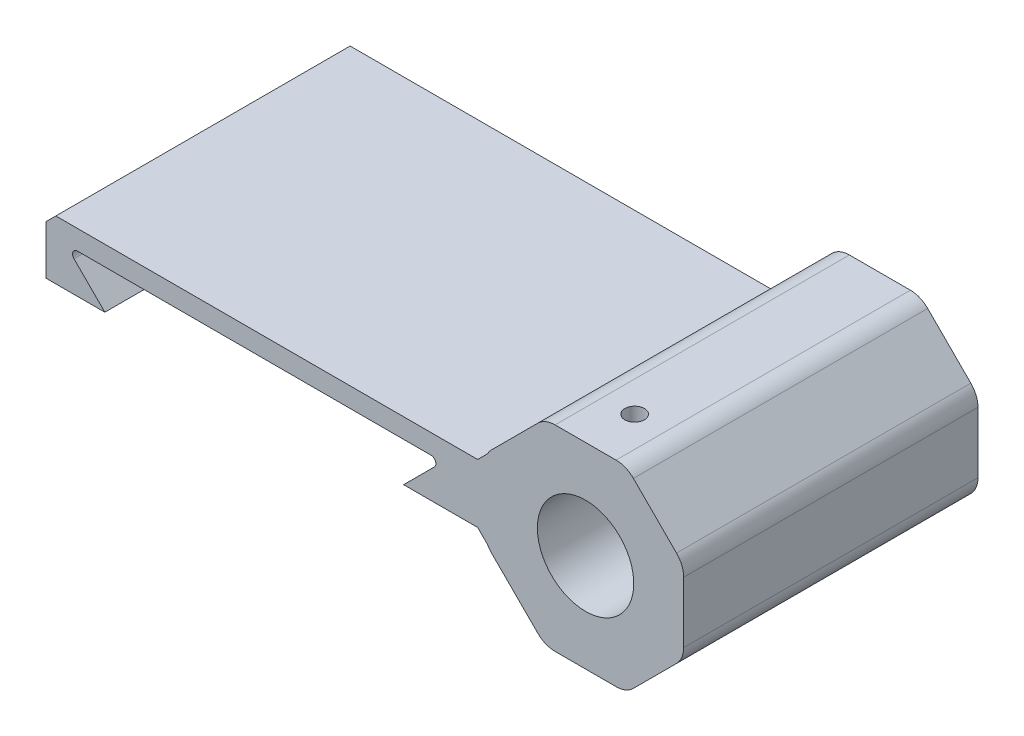
ISO-10303-21;
HEADER;
FILE_DESCRIPTION(('STEP AP214'),'2;1');
FILE_NAME('part.step','',(''),(''),'','','');
FILE_SCHEMA(('AUTOMOTIVE_DESIGN { 1 0 10303 214 1 1 1 1 }'));
ENDSEC;
DATA;
#1=APPLICATION_CONTEXT('core data for automotive mechanical design processes');
#2=APPLICATION_PROTOCOL_DEFINITION('international standard','automotive_design',2000,#1);
#3=PRODUCT_CONTEXT('',#1,'mechanical');
#4=PRODUCT('Part','Part','',(#3));
#5=PRODUCT_RELATED_PRODUCT_CATEGORY('part','',(#4));
#6=PRODUCT_DEFINITION_FORMATION('','',#4);
#7=PRODUCT_DEFINITION_CONTEXT('part definition',#1,'design');
#8=PRODUCT_DEFINITION('design','',#6,#7);
#9=PRODUCT_DEFINITION_SHAPE('','',#8);
#10=(LENGTH_UNIT() NAMED_UNIT(*) SI_UNIT(.MILLI.,.METRE.));
#11=(NAMED_UNIT(*) PLANE_ANGLE_UNIT() SI_UNIT($,.RADIAN.));
#12=(NAMED_UNIT(*) SI_UNIT($,.STERADIAN.) SOLID_ANGLE_UNIT());
#13=UNCERTAINTY_MEASURE_WITH_UNIT(LENGTH_MEASURE(1.E-05),#10,'distance_accuracy_value','');
#14=(GEOMETRIC_REPRESENTATION_CONTEXT(3) GLOBAL_UNCERTAINTY_ASSIGNED_CONTEXT((#13)) GLOBAL_UNIT_ASSIGNED_CONTEXT((#10,
#11,#12)) REPRESENTATION_CONTEXT('',''));
#15=CARTESIAN_POINT('',(0.,0.,0.));
#16=DIRECTION('',(0.,0.,1.));
#17=DIRECTION('',(1.,0.,0.));
#18=AXIS2_PLACEMENT_3D('',#15,#16,#17);
#19=CARTESIAN_POINT('',(-45.,-6.,60.));
#20=DIRECTION('',(0.,1.,0.));
#21=DIRECTION('',(0.,0.,1.));
#22=AXIS2_PLACEMENT_3D('',#19,#20,#21);
#23=PLANE('',#22);
#24=DIRECTION('',(1.,0.,0.));
#25=VECTOR('',#24,1.);
#26=CARTESIAN_POINT('',(-45.,-6.,0.));
#27=LINE('',#26,#25);
#28=CARTESIAN_POINT('',(-45.,-6.,0.));
#29=VERTEX_POINT('',#28);
#30=CARTESIAN_POINT('',(-33.,-6.,0.));
#31=VERTEX_POINT('',#30);
#32=EDGE_CURVE('E231',#29,#31,#27,.T.);
#33=ORIENTED_EDGE('',*,*,#32,.T.);
#34=DIRECTION('',(0.,0.,1.));
#35=VECTOR('',#34,1.);
#36=CARTESIAN_POINT('',(-33.,-6.,-77.3150050119638));
#37=LINE('',#36,#35);
#38=CARTESIAN_POINT('',(-33.,-6.,60.));
#39=VERTEX_POINT('',#38);
#40=EDGE_CURVE('E239',#31,#39,#37,.T.);
#41=ORIENTED_EDGE('',*,*,#40,.T.);
#42=DIRECTION('',(1.,0.,0.));
#43=VECTOR('',#42,1.);
#44=CARTESIAN_POINT('',(-45.,-6.,60.));
#45=LINE('',#44,#43);
#46=CARTESIAN_POINT('',(-45.,-6.,60.));
#47=VERTEX_POINT('',#46);
#48=EDGE_CURVE('E271',#47,#39,#45,.T.);
#49=ORIENTED_EDGE('',*,*,#48,.F.);
#50=DIRECTION('',(0.,0.,-1.));
#51=VECTOR('',#50,1.);
#52=CARTESIAN_POINT('',(-45.,-6.,60.));
#53=LINE('',#52,#51);
#54=EDGE_CURVE('E254',#47,#29,#53,.T.);
#55=ORIENTED_EDGE('',*,*,#54,.T.);
#56=EDGE_LOOP('',(#33,#41,#49,#55));
#57=FACE_BOUND('',#56,.T.);
#58=ADVANCED_FACE('F43',(#57),#23,.F.);
#59=CARTESIAN_POINT('',(-45.,6.,60.));
#60=DIRECTION('',(0.,-1.,0.));
#61=DIRECTION('',(0.,0.,-1.));
#62=AXIS2_PLACEMENT_3D('',#59,#60,#61);
#63=PLANE('',#62);
#64=DIRECTION('',(-1.,0.,0.));
#65=VECTOR('',#64,1.);
#66=CARTESIAN_POINT('',(-45.,6.,60.));
#67=LINE('',#66,#65);
#68=CARTESIAN_POINT('',(42.9999999999999,6.,60.));
#69=VERTEX_POINT('',#68);
#70=CARTESIAN_POINT('',(-43.,6.,60.));
#71=VERTEX_POINT('',#70);
#72=EDGE_CURVE('E256',#69,#71,#67,.T.);
#73=ORIENTED_EDGE('',*,*,#72,.F.);
#74=DIRECTION('',(0.,0.,-1.));
#75=VECTOR('',#74,1.);
#76=CARTESIAN_POINT('',(43.,6.,60.));
#77=LINE('',#76,#75);
#78=CARTESIAN_POINT('',(42.9999999999999,6.,0.));
#79=VERTEX_POINT('',#78);
#80=EDGE_CURVE('E317',#69,#79,#77,.T.);
#81=ORIENTED_EDGE('',*,*,#80,.T.);
#82=DIRECTION('',(-1.,0.,0.));
#83=VECTOR('',#82,1.);
#84=CARTESIAN_POINT('',(-45.,6.,0.));
#85=LINE('',#84,#83);
#86=CARTESIAN_POINT('',(-43.,6.,0.));
#87=VERTEX_POINT('',#86);
#88=EDGE_CURVE('E435',#79,#87,#85,.T.);
#89=ORIENTED_EDGE('',*,*,#88,.T.);
#90=DIRECTION('',(0.,0.,1.));
#91=VECTOR('',#90,1.);
#92=CARTESIAN_POINT('',(-43.,6.,60.));
#93=LINE('',#92,#91);
#94=EDGE_CURVE('E279',#87,#71,#93,.T.);
#95=ORIENTED_EDGE('',*,*,#94,.T.);
#96=EDGE_LOOP('',(#73,#81,#89,#95));
#97=FACE_BOUND('',#96,.T.);
#98=ADVANCED_FACE('F541',(#97),#63,.F.);
#99=CARTESIAN_POINT('',(-45.,-6.,60.));
#100=DIRECTION('',(1.,0.,0.));
#101=DIRECTION('',(0.,0.,-1.));
#102=AXIS2_PLACEMENT_3D('',#99,#100,#101);
#103=PLANE('',#102);
#104=DIRECTION('',(0.,-1.,0.));
#105=VECTOR('',#104,1.);
#106=CARTESIAN_POINT('',(-45.,-6.,60.));
#107=LINE('',#106,#105);
#108=CARTESIAN_POINT('',(-45.,4.00000000000001,60.));
#109=VERTEX_POINT('',#108);
#110=EDGE_CURVE('E261',#109,#47,#107,.T.);
#111=ORIENTED_EDGE('',*,*,#110,.F.);
#112=DIRECTION('',(0.,0.,-1.));
#113=VECTOR('',#112,1.);
#114=CARTESIAN_POINT('',(-45.,4.00000000000001,60.));
#115=LINE('',#114,#113);
#116=CARTESIAN_POINT('',(-45.,4.00000000000001,0.));
#117=VERTEX_POINT('',#116);
#118=EDGE_CURVE('E270',#109,#117,#115,.T.);
#119=ORIENTED_EDGE('',*,*,#118,.T.);
#120=DIRECTION('',(0.,-1.,0.));
#121=VECTOR('',#120,1.);
#122=CARTESIAN_POINT('',(-45.,-6.,0.));
#123=LINE('',#122,#121);
#124=EDGE_CURVE('E264',#117,#29,#123,.T.);
#125=ORIENTED_EDGE('',*,*,#124,.T.);
#126=ORIENTED_EDGE('',*,*,#54,.F.);
#127=EDGE_LOOP('',(#111,#119,#125,#126));
#128=FACE_BOUND('',#127,.T.);
#129=ADVANCED_FACE('F546',(#128),#103,.F.);
#130=CARTESIAN_POINT('',(27.9,-6.,0.));
#131=VERTEX_POINT('',#130);
#132=CARTESIAN_POINT('',(43.,-6.,0.));
#133=VERTEX_POINT('',#132);
#134=EDGE_CURVE('E257',#131,#133,#27,.T.);
#135=ORIENTED_EDGE('',*,*,#134,.T.);
#136=DIRECTION('',(0.,0.,1.));
#137=VECTOR('',#136,1.);
#138=CARTESIAN_POINT('',(43.,-6.,60.));
#139=LINE('',#138,#137);
#140=CARTESIAN_POINT('',(43.,-6.,60.));
#141=VERTEX_POINT('',#140);
#142=EDGE_CURVE('E314',#133,#141,#139,.T.);
#143=ORIENTED_EDGE('',*,*,#142,.T.);
#144=CARTESIAN_POINT('',(27.9,-6.,60.));
#145=VERTEX_POINT('',#144);
#146=EDGE_CURVE('E429',#145,#141,#45,.T.);
#147=ORIENTED_EDGE('',*,*,#146,.F.);
#148=DIRECTION('',(0.,0.,1.));
#149=VECTOR('',#148,1.);
#150=CARTESIAN_POINT('',(27.9,-6.,-77.3150050119638));
#151=LINE('',#150,#149);
#152=EDGE_CURVE('E250',#131,#145,#151,.T.);
#153=ORIENTED_EDGE('',*,*,#152,.F.);
#154=EDGE_LOOP('',(#135,#143,#147,#153));
#155=FACE_BOUND('',#154,.T.);
#156=ADVANCED_FACE('F466',(#155),#23,.F.);
#157=CARTESIAN_POINT('',(0.,0.,60.));
#158=DIRECTION('',(0.,0.,-1.));
#159=DIRECTION('',(-1.,0.,0.));
#160=AXIS2_PLACEMENT_3D('',#157,#158,#159);
#161=PLANE('',#160);
#162=DIRECTION('',(0.707106781186543,-0.707106781186552,0.));
#163=VECTOR('',#162,1.);
#164=CARTESIAN_POINT('',(18.5000000000003,18.5,60.));
#165=LINE('',#164,#163);
#166=CARTESIAN_POINT('',(45.,-8.00000000000001,60.));
#167=VERTEX_POINT('',#166);
#168=EDGE_CURVE('E328',#141,#167,#165,.T.);
#169=ORIENTED_EDGE('',*,*,#168,.T.);
#170=CARTESIAN_POINT('',(49.3857934143694,-5.5989968499658,60.));
#171=DIRECTION('',(0.,0.,-1.));
#172=DIRECTION('',(-1.,0.,0.));
#173=AXIS2_PLACEMENT_3D('',#170,#171,#172);
#174=CIRCLE('',#173,5.);
#175=CARTESIAN_POINT('',(45.8502595084366,-9.13453075589853,60.));
#176=VERTEX_POINT('',#175);
#177=EDGE_CURVE('E389',#167,#176,#174,.F.);
#178=ORIENTED_EDGE('',*,*,#177,.T.);
#179=DIRECTION('',(0.707106781186546,-0.707106781186549,0.));
#180=VECTOR('',#179,1.);
#181=CARTESIAN_POINT('',(56.7157287525381,-20.,60.));
#182=LINE('',#181,#180);
#183=CARTESIAN_POINT('',(55.2512626584708,-18.5355339059328,60.));
#184=VERTEX_POINT('',#183);
#185=EDGE_CURVE('E475',#176,#184,#182,.T.);
#186=ORIENTED_EDGE('',*,*,#185,.T.);
#187=CARTESIAN_POINT('',(58.7867965644036,-15.,60.));
#188=DIRECTION('',(0.,0.,-1.));
#189=DIRECTION('',(-1.,0.,0.));
#190=AXIS2_PLACEMENT_3D('',#187,#188,#189);
#191=CIRCLE('',#190,5.);
#192=CARTESIAN_POINT('',(58.7867965644036,-20.,60.));
#193=VERTEX_POINT('',#192);
#194=EDGE_CURVE('E386',#184,#193,#191,.F.);
#195=ORIENTED_EDGE('',*,*,#194,.T.);
#196=DIRECTION('',(1.,0.,0.));
#197=VECTOR('',#196,1.);
#198=CARTESIAN_POINT('',(73.2842712474619,-20.,60.));
#199=LINE('',#198,#197);
#200=CARTESIAN_POINT('',(71.2132034355965,-20.,60.));
#201=VERTEX_POINT('',#200);
#202=EDGE_CURVE('E517',#193,#201,#199,.T.);
#203=ORIENTED_EDGE('',*,*,#202,.T.);
#204=CARTESIAN_POINT('',(71.2132034355965,-15.,60.));
#205=DIRECTION('',(0.,0.,-1.));
#206=DIRECTION('',(-1.,0.,0.));
#207=AXIS2_PLACEMENT_3D('',#204,#205,#206);
#208=CIRCLE('',#207,5.);
#209=CARTESIAN_POINT('',(74.7487373415292,-18.5355339059328,60.));
#210=VERTEX_POINT('',#209);
#211=EDGE_CURVE('E383',#201,#210,#208,.F.);
#212=ORIENTED_EDGE('',*,*,#211,.T.);
#213=DIRECTION('',(0.707106781186547,0.707106781186548,0.));
#214=VECTOR('',#213,1.);
#215=CARTESIAN_POINT('',(85.,-8.28427124746191,60.));
#216=LINE('',#215,#214);
#217=CARTESIAN_POINT('',(83.5355339059328,-9.74873734152917,60.));
#218=VERTEX_POINT('',#217);
#219=EDGE_CURVE('E599',#210,#218,#216,.T.);
#220=ORIENTED_EDGE('',*,*,#219,.T.);
#221=CARTESIAN_POINT('',(80.,-6.21320343559644,60.));
#222=DIRECTION('',(0.,0.,-1.));
#223=DIRECTION('',(-1.,0.,0.));
#224=AXIS2_PLACEMENT_3D('',#221,#222,#223);
#225=CIRCLE('',#224,5.);
#226=CARTESIAN_POINT('',(85.,-6.21320343559644,60.));
#227=VERTEX_POINT('',#226);
#228=EDGE_CURVE('E380',#218,#227,#225,.F.);
#229=ORIENTED_EDGE('',*,*,#228,.T.);
#230=DIRECTION('',(0.,1.,0.));
#231=VECTOR('',#230,1.);
#232=CARTESIAN_POINT('',(85.,8.28427124746191,60.));
#233=LINE('',#232,#231);
#234=CARTESIAN_POINT('',(85.,6.21320343559645,60.));
#235=VERTEX_POINT('',#234);
#236=EDGE_CURVE('E595',#227,#235,#233,.T.);
#237=ORIENTED_EDGE('',*,*,#236,.T.);
#238=CARTESIAN_POINT('',(80.,6.21320343559645,60.));
#239=DIRECTION('',(0.,0.,-1.));
#240=DIRECTION('',(-1.,0.,0.));
#241=AXIS2_PLACEMENT_3D('',#238,#239,#240);
#242=CIRCLE('',#241,5.);
#243=CARTESIAN_POINT('',(83.5355339059328,9.74873734152918,60.));
#244=VERTEX_POINT('',#243);
#245=EDGE_CURVE('E377',#235,#244,#242,.F.);
#246=ORIENTED_EDGE('',*,*,#245,.T.);
#247=DIRECTION('',(-0.707106781186547,0.707106781186548,0.));
#248=VECTOR('',#247,1.);
#249=CARTESIAN_POINT('',(73.2842712474619,20.,60.));
#250=LINE('',#249,#248);
#251=CARTESIAN_POINT('',(74.7487373415292,18.5355339059328,60.));
#252=VERTEX_POINT('',#251);
#253=EDGE_CURVE('E588',#244,#252,#250,.T.);
#254=ORIENTED_EDGE('',*,*,#253,.T.);
#255=CARTESIAN_POINT('',(71.2132034355965,15.,60.));
#256=DIRECTION('',(0.,0.,-1.));
#257=DIRECTION('',(-1.,0.,0.));
#258=AXIS2_PLACEMENT_3D('',#255,#256,#257);
#259=CIRCLE('',#258,5.);
#260=CARTESIAN_POINT('',(71.2132034355965,20.,60.));
#261=VERTEX_POINT('',#260);
#262=EDGE_CURVE('E374',#252,#261,#259,.F.);
#263=ORIENTED_EDGE('',*,*,#262,.T.);
#264=DIRECTION('',(-1.,0.,0.));
#265=VECTOR('',#264,1.);
#266=CARTESIAN_POINT('',(56.7157287525381,20.,60.));
#267=LINE('',#266,#265);
#268=CARTESIAN_POINT('',(58.7867965644036,20.,60.));
#269=VERTEX_POINT('',#268);
#270=EDGE_CURVE('E585',#261,#269,#267,.T.);
#271=ORIENTED_EDGE('',*,*,#270,.T.);
#272=CARTESIAN_POINT('',(58.7867965644036,15.,60.));
#273=DIRECTION('',(0.,0.,-1.));
#274=DIRECTION('',(-1.,0.,0.));
#275=AXIS2_PLACEMENT_3D('',#272,#273,#274);
#276=CIRCLE('',#275,5.);
#277=CARTESIAN_POINT('',(55.2512626584709,18.5355339059328,60.));
#278=VERTEX_POINT('',#277);
#279=EDGE_CURVE('E65',#269,#278,#276,.F.);
#280=ORIENTED_EDGE('',*,*,#279,.T.);
#281=DIRECTION('',(-0.707106781186548,-0.707106781186547,0.));
#282=VECTOR('',#281,1.);
#283=CARTESIAN_POINT('',(45.,8.2842712474619,60.));
#284=LINE('',#283,#282);
#285=CARTESIAN_POINT('',(45.8502595084367,9.13453075589855,60.));
#286=VERTEX_POINT('',#285);
#287=EDGE_CURVE('E484',#278,#286,#284,.T.);
#288=ORIENTED_EDGE('',*,*,#287,.T.);
#289=CARTESIAN_POINT('',(49.3857934143694,5.59899684996581,60.));
#290=DIRECTION('',(0.,0.,-1.));
#291=DIRECTION('',(-1.,0.,0.));
#292=AXIS2_PLACEMENT_3D('',#289,#290,#291);
#293=CIRCLE('',#292,5.);
#294=CARTESIAN_POINT('',(45.,8.00000000000001,60.));
#295=VERTEX_POINT('',#294);
#296=EDGE_CURVE('E369',#286,#295,#293,.F.);
#297=ORIENTED_EDGE('',*,*,#296,.T.);
#298=DIRECTION('',(-0.70710678118655,-0.707106781186545,0.));
#299=VECTOR('',#298,1.);
#300=CARTESIAN_POINT('',(18.4999999999998,-18.5,60.));
#301=LINE('',#300,#299);
#302=EDGE_CURVE('E335',#295,#69,#301,.T.);
#303=ORIENTED_EDGE('',*,*,#302,.T.);
#304=ORIENTED_EDGE('',*,*,#72,.T.);
#305=DIRECTION('',(0.707106781186548,0.707106781186547,0.));
#306=VECTOR('',#305,1.);
#307=CARTESIAN_POINT('',(-45.,4.00000000000001,60.));
#308=LINE('',#307,#306);
#309=EDGE_CURVE('E283',#71,#109,#308,.F.);
#310=ORIENTED_EDGE('',*,*,#309,.T.);
#311=ORIENTED_EDGE('',*,*,#110,.T.);
#312=ORIENTED_EDGE('',*,*,#48,.T.);
#313=DIRECTION('',(0.707106781186546,-0.707106781186549,0.));
#314=VECTOR('',#313,1.);
#315=CARTESIAN_POINT('',(-41.,2.,60.));
#316=LINE('',#315,#314);
#317=CARTESIAN_POINT('',(-39.2928932188134,0.292893218813453,60.));
#318=VERTEX_POINT('',#317);
#319=EDGE_CURVE('E245',#318,#39,#316,.T.);
#320=ORIENTED_EDGE('',*,*,#319,.F.);
#321=CARTESIAN_POINT('',(-38.5857864376269,1.,60.));
#322=DIRECTION('',(0.,0.,-1.));
#323=DIRECTION('',(-1.,0.,0.));
#324=AXIS2_PLACEMENT_3D('',#321,#322,#323);
#325=CIRCLE('',#324,1.);
#326=CARTESIAN_POINT('',(-38.5857864376269,2.,60.));
#327=VERTEX_POINT('',#326);
#328=EDGE_CURVE('E305',#318,#327,#325,.T.);
#329=ORIENTED_EDGE('',*,*,#328,.T.);
#330=DIRECTION('',(-1.,0.,0.));
#331=VECTOR('',#330,1.);
#332=CARTESIAN_POINT('',(35.9,2.00000000000001,60.));
#333=LINE('',#332,#331);
#334=CARTESIAN_POINT('',(33.4857864376269,2.00000000000001,60.));
#335=VERTEX_POINT('',#334);
#336=EDGE_CURVE('E516',#335,#327,#333,.T.);
#337=ORIENTED_EDGE('',*,*,#336,.F.);
#338=CARTESIAN_POINT('',(33.4857864376269,1.00000000000001,60.));
#339=DIRECTION('',(0.,0.,-1.));
#340=DIRECTION('',(-1.,0.,0.));
#341=AXIS2_PLACEMENT_3D('',#338,#339,#340);
#342=CIRCLE('',#341,1.);
#343=CARTESIAN_POINT('',(34.1928932188134,0.292893218813462,60.));
#344=VERTEX_POINT('',#343);
#345=EDGE_CURVE('E299',#335,#344,#342,.T.);
#346=ORIENTED_EDGE('',*,*,#345,.T.);
#347=DIRECTION('',(0.707106781186545,0.70710678118655,0.));
#348=VECTOR('',#347,1.);
#349=CARTESIAN_POINT('',(27.9,-6.,60.));
#350=LINE('',#349,#348);
#351=EDGE_CURVE('E240',#145,#344,#350,.T.);
#352=ORIENTED_EDGE('',*,*,#351,.F.);
#353=ORIENTED_EDGE('',*,*,#146,.T.);
#354=EDGE_LOOP('',(#169,#178,#186,#195,#203,#212,#220,#229,#237,#246,#254,#263,#271,#280,#288,
#297,#303,#304,#310,#311,#312,#320,#329,#337,#346,#352,#353));
#355=FACE_BOUND('',#354,.T.);
#356=CARTESIAN_POINT('',(65.,0.,60.));
#357=DIRECTION('',(0.,0.,-1.));
#358=DIRECTION('',(-1.,0.,0.));
#359=AXIS2_PLACEMENT_3D('',#356,#357,#358);
#360=CIRCLE('',#359,9.825);
#361=CARTESIAN_POINT('',(55.175,0.,60.));
#362=VERTEX_POINT('',#361);
#363=EDGE_CURVE('E513',#362,#362,#360,.F.);
#364=ORIENTED_EDGE('',*,*,#363,.F.);
#365=EDGE_LOOP('',(#364));
#366=FACE_BOUND('',#365,.T.);
#367=ADVANCED_FACE('F460',(#355,#366),#161,.F.);
#368=CARTESIAN_POINT('',(0.,0.,0.));
#369=DIRECTION('',(0.,0.,-1.));
#370=DIRECTION('',(-1.,0.,0.));
#371=AXIS2_PLACEMENT_3D('',#368,#369,#370);
#372=PLANE('',#371);
#373=DIRECTION('',(-0.707106781186546,0.707106781186549,0.));
#374=VECTOR('',#373,1.);
#375=CARTESIAN_POINT('',(56.7157287525381,-20.,0.));
#376=LINE('',#375,#374);
#377=CARTESIAN_POINT('',(55.2512626584708,-18.5355339059328,0.));
#378=VERTEX_POINT('',#377);
#379=CARTESIAN_POINT('',(45.8502595084366,-9.13453075589853,0.));
#380=VERTEX_POINT('',#379);
#381=EDGE_CURVE('E488',#378,#380,#376,.T.);
#382=ORIENTED_EDGE('',*,*,#381,.T.);
#383=CARTESIAN_POINT('',(49.3857934143694,-5.5989968499658,0.));
#384=DIRECTION('',(0.,0.,-1.));
#385=DIRECTION('',(-1.,0.,0.));
#386=AXIS2_PLACEMENT_3D('',#383,#384,#385);
#387=CIRCLE('',#386,5.);
#388=CARTESIAN_POINT('',(45.,-8.00000000000001,0.));
#389=VERTEX_POINT('',#388);
#390=EDGE_CURVE('E366',#380,#389,#387,.T.);
#391=ORIENTED_EDGE('',*,*,#390,.T.);
#392=DIRECTION('',(-0.707106781186543,0.707106781186552,0.));
#393=VECTOR('',#392,1.);
#394=CARTESIAN_POINT('',(45.,-8.00000000000001,0.));
#395=LINE('',#394,#393);
#396=EDGE_CURVE('E325',#389,#133,#395,.T.);
#397=ORIENTED_EDGE('',*,*,#396,.T.);
#398=ORIENTED_EDGE('',*,*,#134,.F.);
#399=DIRECTION('',(0.707106781186545,0.70710678118655,0.));
#400=VECTOR('',#399,1.);
#401=CARTESIAN_POINT('',(27.9,-6.,0.));
#402=LINE('',#401,#400);
#403=CARTESIAN_POINT('',(34.1928932188134,0.292893218813466,0.));
#404=VERTEX_POINT('',#403);
#405=EDGE_CURVE('E442',#131,#404,#402,.T.);
#406=ORIENTED_EDGE('',*,*,#405,.T.);
#407=CARTESIAN_POINT('',(33.4857864376269,1.00000000000001,0.));
#408=DIRECTION('',(0.,0.,-1.));
#409=DIRECTION('',(-1.,0.,0.));
#410=AXIS2_PLACEMENT_3D('',#407,#408,#409);
#411=CIRCLE('',#410,1.);
#412=CARTESIAN_POINT('',(33.4857864376269,2.00000000000001,0.));
#413=VERTEX_POINT('',#412);
#414=EDGE_CURVE('E302',#404,#413,#411,.F.);
#415=ORIENTED_EDGE('',*,*,#414,.T.);
#416=DIRECTION('',(-1.,0.,0.));
#417=VECTOR('',#416,1.);
#418=CARTESIAN_POINT('',(35.9,2.00000000000001,0.));
#419=LINE('',#418,#417);
#420=CARTESIAN_POINT('',(-38.5857864376269,2.,0.));
#421=VERTEX_POINT('',#420);
#422=EDGE_CURVE('E437',#413,#421,#419,.T.);
#423=ORIENTED_EDGE('',*,*,#422,.T.);
#424=CARTESIAN_POINT('',(-38.5857864376269,1.,0.));
#425=DIRECTION('',(0.,0.,-1.));
#426=DIRECTION('',(-1.,0.,0.));
#427=AXIS2_PLACEMENT_3D('',#424,#425,#426);
#428=CIRCLE('',#427,1.);
#429=CARTESIAN_POINT('',(-39.2928932188134,0.292893218813453,0.));
#430=VERTEX_POINT('',#429);
#431=EDGE_CURVE('E234',#421,#430,#428,.F.);
#432=ORIENTED_EDGE('',*,*,#431,.T.);
#433=DIRECTION('',(0.707106781186546,-0.707106781186549,0.));
#434=VECTOR('',#433,1.);
#435=CARTESIAN_POINT('',(-41.,2.,0.));
#436=LINE('',#435,#434);
#437=EDGE_CURVE('E224',#430,#31,#436,.T.);
#438=ORIENTED_EDGE('',*,*,#437,.T.);
#439=ORIENTED_EDGE('',*,*,#32,.F.);
#440=ORIENTED_EDGE('',*,*,#124,.F.);
#441=DIRECTION('',(-0.707106781186548,-0.707106781186547,0.));
#442=VECTOR('',#441,1.);
#443=CARTESIAN_POINT('',(-24.5,24.5,0.));
#444=LINE('',#443,#442);
#445=EDGE_CURVE('E275',#117,#87,#444,.F.);
#446=ORIENTED_EDGE('',*,*,#445,.T.);
#447=ORIENTED_EDGE('',*,*,#88,.F.);
#448=DIRECTION('',(0.70710678118655,0.707106781186545,0.));
#449=VECTOR('',#448,1.);
#450=CARTESIAN_POINT('',(43.,6.,0.));
#451=LINE('',#450,#449);
#452=CARTESIAN_POINT('',(45.,8.00000000000001,0.));
#453=VERTEX_POINT('',#452);
#454=EDGE_CURVE('E331',#79,#453,#451,.T.);
#455=ORIENTED_EDGE('',*,*,#454,.T.);
#456=CARTESIAN_POINT('',(49.3857934143694,5.59899684996581,0.));
#457=DIRECTION('',(0.,0.,-1.));
#458=DIRECTION('',(-1.,0.,0.));
#459=AXIS2_PLACEMENT_3D('',#456,#457,#458);
#460=CIRCLE('',#459,5.);
#461=CARTESIAN_POINT('',(45.8502595084367,9.13453075589856,0.));
#462=VERTEX_POINT('',#461);
#463=EDGE_CURVE('E345',#453,#462,#460,.T.);
#464=ORIENTED_EDGE('',*,*,#463,.T.);
#465=DIRECTION('',(0.707106781186548,0.707106781186547,0.));
#466=VECTOR('',#465,1.);
#467=CARTESIAN_POINT('',(45.,8.2842712474619,0.));
#468=LINE('',#467,#466);
#469=CARTESIAN_POINT('',(55.2512626584709,18.5355339059328,0.));
#470=VERTEX_POINT('',#469);
#471=EDGE_CURVE('E491',#462,#470,#468,.T.);
#472=ORIENTED_EDGE('',*,*,#471,.T.);
#473=CARTESIAN_POINT('',(58.7867965644036,15.,0.));
#474=DIRECTION('',(0.,0.,-1.));
#475=DIRECTION('',(-1.,0.,0.));
#476=AXIS2_PLACEMENT_3D('',#473,#474,#475);
#477=CIRCLE('',#476,5.);
#478=CARTESIAN_POINT('',(58.7867965644036,20.,0.));
#479=VERTEX_POINT('',#478);
#480=EDGE_CURVE('E348',#470,#479,#477,.T.);
#481=ORIENTED_EDGE('',*,*,#480,.T.);
#482=DIRECTION('',(1.,0.,0.));
#483=VECTOR('',#482,1.);
#484=CARTESIAN_POINT('',(56.7157287525381,20.,0.));
#485=LINE('',#484,#483);
#486=CARTESIAN_POINT('',(71.2132034355965,20.,0.));
#487=VERTEX_POINT('',#486);
#488=EDGE_CURVE('E497',#479,#487,#485,.T.);
#489=ORIENTED_EDGE('',*,*,#488,.T.);
#490=CARTESIAN_POINT('',(71.2132034355965,15.,0.));
#491=DIRECTION('',(0.,0.,-1.));
#492=DIRECTION('',(-1.,0.,0.));
#493=AXIS2_PLACEMENT_3D('',#490,#491,#492);
#494=CIRCLE('',#493,5.);
#495=CARTESIAN_POINT('',(74.7487373415292,18.5355339059328,0.));
#496=VERTEX_POINT('',#495);
#497=EDGE_CURVE('E351',#487,#496,#494,.T.);
#498=ORIENTED_EDGE('',*,*,#497,.T.);
#499=DIRECTION('',(0.707106781186547,-0.707106781186548,0.));
#500=VECTOR('',#499,1.);
#501=CARTESIAN_POINT('',(73.2842712474619,20.,0.));
#502=LINE('',#501,#500);
#503=CARTESIAN_POINT('',(83.5355339059328,9.74873734152918,0.));
#504=VERTEX_POINT('',#503);
#505=EDGE_CURVE('E506',#496,#504,#502,.T.);
#506=ORIENTED_EDGE('',*,*,#505,.T.);
#507=CARTESIAN_POINT('',(80.,6.21320343559645,0.));
#508=DIRECTION('',(0.,0.,-1.));
#509=DIRECTION('',(-1.,0.,0.));
#510=AXIS2_PLACEMENT_3D('',#507,#508,#509);
#511=CIRCLE('',#510,5.);
#512=CARTESIAN_POINT('',(85.,6.21320343559645,0.));
#513=VERTEX_POINT('',#512);
#514=EDGE_CURVE('E354',#504,#513,#511,.T.);
#515=ORIENTED_EDGE('',*,*,#514,.T.);
#516=DIRECTION('',(0.,-1.,0.));
#517=VECTOR('',#516,1.);
#518=CARTESIAN_POINT('',(85.,8.28427124746191,0.));
#519=LINE('',#518,#517);
#520=CARTESIAN_POINT('',(85.,-6.21320343559644,0.));
#521=VERTEX_POINT('',#520);
#522=EDGE_CURVE('E485',#513,#521,#519,.T.);
#523=ORIENTED_EDGE('',*,*,#522,.T.);
#524=CARTESIAN_POINT('',(80.,-6.21320343559644,0.));
#525=DIRECTION('',(0.,0.,-1.));
#526=DIRECTION('',(-1.,0.,0.));
#527=AXIS2_PLACEMENT_3D('',#524,#525,#526);
#528=CIRCLE('',#527,5.);
#529=CARTESIAN_POINT('',(83.5355339059328,-9.74873734152917,0.));
#530=VERTEX_POINT('',#529);
#531=EDGE_CURVE('E357',#521,#530,#528,.T.);
#532=ORIENTED_EDGE('',*,*,#531,.T.);
#533=DIRECTION('',(-0.707106781186547,-0.707106781186548,0.));
#534=VECTOR('',#533,1.);
#535=CARTESIAN_POINT('',(85.,-8.28427124746191,0.));
#536=LINE('',#535,#534);
#537=CARTESIAN_POINT('',(74.7487373415292,-18.5355339059328,0.));
#538=VERTEX_POINT('',#537);
#539=EDGE_CURVE('E499',#530,#538,#536,.T.);
#540=ORIENTED_EDGE('',*,*,#539,.T.);
#541=CARTESIAN_POINT('',(71.2132034355965,-15.,0.));
#542=DIRECTION('',(0.,0.,-1.));
#543=DIRECTION('',(-1.,0.,0.));
#544=AXIS2_PLACEMENT_3D('',#541,#542,#543);
#545=CIRCLE('',#544,5.);
#546=CARTESIAN_POINT('',(71.2132034355965,-20.,0.));
#547=VERTEX_POINT('',#546);
#548=EDGE_CURVE('E360',#538,#547,#545,.T.);
#549=ORIENTED_EDGE('',*,*,#548,.T.);
#550=DIRECTION('',(-1.,0.,0.));
#551=VECTOR('',#550,1.);
#552=CARTESIAN_POINT('',(73.2842712474619,-20.,0.));
#553=LINE('',#552,#551);
#554=CARTESIAN_POINT('',(58.7867965644036,-20.,0.));
#555=VERTEX_POINT('',#554);
#556=EDGE_CURVE('E492',#547,#555,#553,.T.);
#557=ORIENTED_EDGE('',*,*,#556,.T.);
#558=CARTESIAN_POINT('',(58.7867965644036,-15.,0.));
#559=DIRECTION('',(0.,0.,-1.));
#560=DIRECTION('',(-1.,0.,0.));
#561=AXIS2_PLACEMENT_3D('',#558,#559,#560);
#562=CIRCLE('',#561,5.);
#563=EDGE_CURVE('E363',#555,#378,#562,.T.);
#564=ORIENTED_EDGE('',*,*,#563,.T.);
#565=EDGE_LOOP('',(#382,#391,#397,#398,#406,#415,#423,#432,#438,#439,#440,#446,#447,#455,#464,
#472,#481,#489,#498,#506,#515,#523,#532,#540,#549,#557,#564));
#566=FACE_BOUND('',#565,.T.);
#567=CARTESIAN_POINT('',(65.,0.,0.));
#568=DIRECTION('',(0.,0.,-1.));
#569=DIRECTION('',(-1.,0.,0.));
#570=AXIS2_PLACEMENT_3D('',#567,#568,#569);
#571=CIRCLE('',#570,9.825);
#572=CARTESIAN_POINT('',(55.175,0.,0.));
#573=VERTEX_POINT('',#572);
#574=EDGE_CURVE('E603',#573,#573,#571,.T.);
#575=ORIENTED_EDGE('',*,*,#574,.F.);
#576=EDGE_LOOP('',(#575));
#577=FACE_BOUND('',#576,.T.);
#578=ADVANCED_FACE('F227',(#566,#577),#372,.T.);
#579=CARTESIAN_POINT('',(-41.,2.,-77.3150050119638));
#580=DIRECTION('',(-0.707106781186549,-0.707106781186546,0.));
#581=DIRECTION('',(0.707106781186546,-0.707106781186549,0.));
#582=AXIS2_PLACEMENT_3D('',#579,#580,#581);
#583=PLANE('',#582);
#584=ORIENTED_EDGE('',*,*,#437,.F.);
#585=DIRECTION('',(0.,0.,1.));
#586=VECTOR('',#585,1.);
#587=CARTESIAN_POINT('',(-39.2928932188134,0.292893218813452,60.));
#588=LINE('',#587,#586);
#589=EDGE_CURVE('E296',#430,#318,#588,.T.);
#590=ORIENTED_EDGE('',*,*,#589,.T.);
#591=ORIENTED_EDGE('',*,*,#319,.T.);
#592=ORIENTED_EDGE('',*,*,#40,.F.);
#593=EDGE_LOOP('',(#584,#590,#591,#592));
#594=FACE_BOUND('',#593,.T.);
#595=ADVANCED_FACE('F243',(#594),#583,.F.);
#596=CARTESIAN_POINT('',(27.9,-6.,-77.3150050119638));
#597=DIRECTION('',(0.70710678118655,-0.707106781186545,0.));
#598=DIRECTION('',(0.707106781186545,0.70710678118655,0.));
#599=AXIS2_PLACEMENT_3D('',#596,#597,#598);
#600=PLANE('',#599);
#601=ORIENTED_EDGE('',*,*,#351,.T.);
#602=DIRECTION('',(0.,0.,1.));
#603=VECTOR('',#602,1.);
#604=CARTESIAN_POINT('',(34.1928932188134,0.292893218813462,0.));
#605=LINE('',#604,#603);
#606=EDGE_CURVE('E293',#344,#404,#605,.F.);
#607=ORIENTED_EDGE('',*,*,#606,.T.);
#608=ORIENTED_EDGE('',*,*,#405,.F.);
#609=ORIENTED_EDGE('',*,*,#152,.T.);
#610=EDGE_LOOP('',(#601,#607,#608,#609));
#611=FACE_BOUND('',#610,.T.);
#612=ADVANCED_FACE('F455',(#611),#600,.F.);
#613=CARTESIAN_POINT('',(35.9,2.00000000000001,-77.3150050119638));
#614=DIRECTION('',(0.,1.,0.));
#615=DIRECTION('',(-1.,0.,0.));
#616=AXIS2_PLACEMENT_3D('',#613,#614,#615);
#617=PLANE('',#616);
#618=ORIENTED_EDGE('',*,*,#422,.F.);
#619=DIRECTION('',(0.,0.,1.));
#620=VECTOR('',#619,1.);
#621=CARTESIAN_POINT('',(33.4857864376269,2.00000000000001,60.));
#622=LINE('',#621,#620);
#623=EDGE_CURVE('E289',#413,#335,#622,.T.);
#624=ORIENTED_EDGE('',*,*,#623,.T.);
#625=ORIENTED_EDGE('',*,*,#336,.T.);
#626=DIRECTION('',(0.,0.,1.));
#627=VECTOR('',#626,1.);
#628=CARTESIAN_POINT('',(-38.5857864376269,2.,0.));
#629=LINE('',#628,#627);
#630=EDGE_CURVE('E286',#327,#421,#629,.F.);
#631=ORIENTED_EDGE('',*,*,#630,.T.);
#632=EDGE_LOOP('',(#618,#624,#625,#631));
#633=FACE_BOUND('',#632,.T.);
#634=ADVANCED_FACE('F524',(#633),#617,.F.);
#635=CARTESIAN_POINT('',(73.2842712474619,-20.,116.568542494924));
#636=DIRECTION('',(0.,-1.,0.));
#637=DIRECTION('',(1.,0.,0.));
#638=AXIS2_PLACEMENT_3D('',#635,#636,#637);
#639=PLANE('',#638);
#640=ORIENTED_EDGE('',*,*,#202,.F.);
#641=DIRECTION('',(0.,0.,-1.));
#642=VECTOR('',#641,1.);
#643=CARTESIAN_POINT('',(58.7867965644036,-20.,116.568542494924));
#644=LINE('',#643,#642);
#645=EDGE_CURVE('E395',#193,#555,#644,.T.);
#646=ORIENTED_EDGE('',*,*,#645,.T.);
#647=ORIENTED_EDGE('',*,*,#556,.F.);
#648=DIRECTION('',(0.,0.,-1.));
#649=VECTOR('',#648,1.);
#650=CARTESIAN_POINT('',(71.2132034355965,-20.,116.568542494924));
#651=LINE('',#650,#649);
#652=EDGE_CURVE('E392',#547,#201,#651,.F.);
#653=ORIENTED_EDGE('',*,*,#652,.T.);
#654=EDGE_LOOP('',(#640,#646,#647,#653));
#655=FACE_BOUND('',#654,.T.);
#656=ADVANCED_FACE('F653',(#655),#639,.T.);
#657=CARTESIAN_POINT('',(56.7157287525381,-20.,116.568542494924));
#658=DIRECTION('',(-0.707106781186549,-0.707106781186546,0.));
#659=DIRECTION('',(0.707106781186546,-0.707106781186549,0.));
#660=AXIS2_PLACEMENT_3D('',#657,#658,#659);
#661=PLANE('',#660);
#662=ORIENTED_EDGE('',*,*,#185,.F.);
#663=DIRECTION('',(0.,0.,1.));
#664=VECTOR('',#663,1.);
#665=CARTESIAN_POINT('',(45.8502595084366,-9.13453075589853,0.));
#666=LINE('',#665,#664);
#667=EDGE_CURVE('E341',#176,#380,#666,.F.);
#668=ORIENTED_EDGE('',*,*,#667,.T.);
#669=ORIENTED_EDGE('',*,*,#381,.F.);
#670=DIRECTION('',(0.,0.,-1.));
#671=VECTOR('',#670,1.);
#672=CARTESIAN_POINT('',(55.2512626584708,-18.5355339059328,116.568542494924));
#673=LINE('',#672,#671);
#674=EDGE_CURVE('E338',#378,#184,#673,.F.);
#675=ORIENTED_EDGE('',*,*,#674,.T.);
#676=EDGE_LOOP('',(#662,#668,#669,#675));
#677=FACE_BOUND('',#676,.T.);
#678=ADVANCED_FACE('F480',(#677),#661,.T.);
#679=CARTESIAN_POINT('',(45.,8.2842712474619,116.568542494924));
#680=DIRECTION('',(-0.707106781186547,0.707106781186548,0.));
#681=DIRECTION('',(-0.707106781186548,-0.707106781186547,0.));
#682=AXIS2_PLACEMENT_3D('',#679,#680,#681);
#683=PLANE('',#682);
#684=ORIENTED_EDGE('',*,*,#287,.F.);
#685=DIRECTION('',(0.,0.,-1.));
#686=VECTOR('',#685,1.);
#687=CARTESIAN_POINT('',(55.2512626584709,18.5355339059328,116.568542494924));
#688=LINE('',#687,#686);
#689=EDGE_CURVE('E11',#278,#470,#688,.T.);
#690=ORIENTED_EDGE('',*,*,#689,.T.);
#691=ORIENTED_EDGE('',*,*,#471,.F.);
#692=DIRECTION('',(0.,0.,-1.));
#693=VECTOR('',#692,1.);
#694=CARTESIAN_POINT('',(45.8502595084367,9.13453075589855,60.));
#695=LINE('',#694,#693);
#696=EDGE_CURVE('E52',#462,#286,#695,.F.);
#697=ORIENTED_EDGE('',*,*,#696,.T.);
#698=EDGE_LOOP('',(#684,#690,#691,#697));
#699=FACE_BOUND('',#698,.T.);
#700=ADVANCED_FACE('F644',(#699),#683,.T.);
#701=CARTESIAN_POINT('',(56.7157287525381,20.,116.568542494924));
#702=DIRECTION('',(0.,1.,0.));
#703=DIRECTION('',(0.,0.,1.));
#704=AXIS2_PLACEMENT_3D('',#701,#702,#703);
#705=PLANE('',#704);
#706=CARTESIAN_POINT('',(65.,20.,50.));
#707=DIRECTION('',(0.,1.,0.));
#708=DIRECTION('',(0.,0.,1.));
#709=AXIS2_PLACEMENT_3D('',#706,#707,#708);
#710=CIRCLE('',#709,2.);
#711=CARTESIAN_POINT('',(65.,20.,52.));
#712=VERTEX_POINT('',#711);
#713=EDGE_CURVE('E837',#712,#712,#710,.T.);
#714=ORIENTED_EDGE('',*,*,#713,.F.);
#715=EDGE_LOOP('',(#714));
#716=FACE_BOUND('',#715,.T.);
#717=ORIENTED_EDGE('',*,*,#270,.F.);
#718=DIRECTION('',(0.,0.,-1.));
#719=VECTOR('',#718,1.);
#720=CARTESIAN_POINT('',(71.2132034355965,20.,116.568542494924));
#721=LINE('',#720,#719);
#722=EDGE_CURVE('E423',#261,#487,#721,.T.);
#723=ORIENTED_EDGE('',*,*,#722,.T.);
#724=ORIENTED_EDGE('',*,*,#488,.F.);
#725=DIRECTION('',(0.,0.,-1.));
#726=VECTOR('',#725,1.);
#727=CARTESIAN_POINT('',(58.7867965644036,20.,116.568542494924));
#728=LINE('',#727,#726);
#729=EDGE_CURVE('E420',#479,#269,#728,.F.);
#730=ORIENTED_EDGE('',*,*,#729,.T.);
#731=EDGE_LOOP('',(#717,#723,#724,#730));
#732=FACE_BOUND('',#731,.T.);
#733=ADVANCED_FACE('F639',(#716,#732),#705,.T.);
#734=CARTESIAN_POINT('',(73.2842712474619,20.,116.568542494924));
#735=DIRECTION('',(0.707106781186548,0.707106781186547,0.));
#736=DIRECTION('',(-0.707106781186547,0.707106781186548,0.));
#737=AXIS2_PLACEMENT_3D('',#734,#735,#736);
#738=PLANE('',#737);
#739=ORIENTED_EDGE('',*,*,#253,.F.);
#740=DIRECTION('',(0.,0.,-1.));
#741=VECTOR('',#740,1.);
#742=CARTESIAN_POINT('',(83.5355339059328,9.74873734152918,116.568542494924));
#743=LINE('',#742,#741);
#744=EDGE_CURVE('E416',#244,#504,#743,.T.);
#745=ORIENTED_EDGE('',*,*,#744,.T.);
#746=ORIENTED_EDGE('',*,*,#505,.F.);
#747=DIRECTION('',(0.,0.,-1.));
#748=VECTOR('',#747,1.);
#749=CARTESIAN_POINT('',(74.7487373415292,18.5355339059328,116.568542494924));
#750=LINE('',#749,#748);
#751=EDGE_CURVE('E413',#496,#252,#750,.F.);
#752=ORIENTED_EDGE('',*,*,#751,.T.);
#753=EDGE_LOOP('',(#739,#745,#746,#752));
#754=FACE_BOUND('',#753,.T.);
#755=ADVANCED_FACE('F631',(#754),#738,.T.);
#756=CARTESIAN_POINT('',(85.,8.28427124746191,116.568542494924));
#757=DIRECTION('',(1.,0.,0.));
#758=DIRECTION('',(0.,0.,-1.));
#759=AXIS2_PLACEMENT_3D('',#756,#757,#758);
#760=PLANE('',#759);
#761=ORIENTED_EDGE('',*,*,#236,.F.);
#762=DIRECTION('',(0.,0.,-1.));
#763=VECTOR('',#762,1.);
#764=CARTESIAN_POINT('',(85.,-6.21320343559644,116.568542494924));
#765=LINE('',#764,#763);
#766=EDGE_CURVE('E409',#227,#521,#765,.T.);
#767=ORIENTED_EDGE('',*,*,#766,.T.);
#768=ORIENTED_EDGE('',*,*,#522,.F.);
#769=DIRECTION('',(0.,0.,-1.));
#770=VECTOR('',#769,1.);
#771=CARTESIAN_POINT('',(85.,6.21320343559645,116.568542494924));
#772=LINE('',#771,#770);
#773=EDGE_CURVE('E406',#513,#235,#772,.F.);
#774=ORIENTED_EDGE('',*,*,#773,.T.);
#775=EDGE_LOOP('',(#761,#767,#768,#774));
#776=FACE_BOUND('',#775,.T.);
#777=ADVANCED_FACE('F622',(#776),#760,.T.);
#778=CARTESIAN_POINT('',(85.,-8.28427124746191,116.568542494924));
#779=DIRECTION('',(0.707106781186548,-0.707106781186547,0.));
#780=DIRECTION('',(0.707106781186547,0.707106781186548,0.));
#781=AXIS2_PLACEMENT_3D('',#778,#779,#780);
#782=PLANE('',#781);
#783=ORIENTED_EDGE('',*,*,#219,.F.);
#784=DIRECTION('',(0.,0.,-1.));
#785=VECTOR('',#784,1.);
#786=CARTESIAN_POINT('',(74.7487373415292,-18.5355339059328,116.568542494924));
#787=LINE('',#786,#785);
#788=EDGE_CURVE('E402',#210,#538,#787,.T.);
#789=ORIENTED_EDGE('',*,*,#788,.T.);
#790=ORIENTED_EDGE('',*,*,#539,.F.);
#791=DIRECTION('',(0.,0.,-1.));
#792=VECTOR('',#791,1.);
#793=CARTESIAN_POINT('',(83.5355339059328,-9.74873734152917,116.568542494924));
#794=LINE('',#793,#792);
#795=EDGE_CURVE('E399',#530,#218,#794,.F.);
#796=ORIENTED_EDGE('',*,*,#795,.T.);
#797=EDGE_LOOP('',(#783,#789,#790,#796));
#798=FACE_BOUND('',#797,.T.);
#799=ADVANCED_FACE('F570',(#798),#782,.T.);
#800=CARTESIAN_POINT('',(65.,0.,116.568542494924));
#801=DIRECTION('',(0.,0.,-1.));
#802=DIRECTION('',(-1.,0.,0.));
#803=AXIS2_PLACEMENT_3D('',#800,#801,#802);
#804=CYLINDRICAL_SURFACE('',#803,9.825);
#805=CARTESIAN_POINT('',(65.,9.825,52.));
#806=CARTESIAN_POINT('',(64.8888881894451,9.82499794701629,51.9999959628161));
#807=CARTESIAN_POINT('',(64.7777257680233,9.82309582948919,51.9907093424743));
#808=CARTESIAN_POINT('',(64.5585458667907,9.81569142180117,51.9538393872812));
#809=CARTESIAN_POINT('',(64.4505309079396,9.81018632436579,51.9262417851327));
#810=CARTESIAN_POINT('',(64.2408463421084,9.79619035516827,51.8536400270364));
#811=CARTESIAN_POINT('',(64.1391706670718,9.78770239196453,51.8086528232353));
#812=CARTESIAN_POINT('',(63.9448167317319,9.76866219123544,51.7025999036008));
#813=CARTESIAN_POINT('',(63.852137992274,9.75811006373274,51.6415350446675));
#814=CARTESIAN_POINT('',(63.6771043919083,9.73593667608176,51.5041538638618));
#815=CARTESIAN_POINT('',(63.5948936652114,9.72430366205995,51.4276557839275));
#816=CARTESIAN_POINT('',(63.4443781150379,9.70136462547713,51.2619702884068));
#817=CARTESIAN_POINT('',(63.3760744046486,9.690058629152,51.172781858082));
#818=CARTESIAN_POINT('',(63.2546941592633,9.66893876542444,50.9832052953196));
#819=CARTESIAN_POINT('',(63.2017676407092,9.65914001035349,50.8827192789606));
#820=CARTESIAN_POINT('',(63.1136054492899,9.64231134830845,50.6740480558707));
#821=CARTESIAN_POINT('',(63.0783679621055,9.63528115738568,50.5658636400452));
#822=CARTESIAN_POINT('',(63.0270535710033,9.62490468037679,50.3464197246597));
#823=CARTESIAN_POINT('',(63.0107233503463,9.62150973733814,50.235221808388));
#824=CARTESIAN_POINT('',(62.9969000675597,9.61864175040048,50.0116166556101));
#825=CARTESIAN_POINT('',(62.9994050084739,9.61916829073482,49.8992095485675));
#826=CARTESIAN_POINT('',(63.0229763094012,9.62403959850302,49.6782355966181));
#827=CARTESIAN_POINT('',(63.043751571312,9.62832448205511,49.5696361826666));
#828=CARTESIAN_POINT('',(63.1028139816124,9.64013531585848,49.3574971143936));
#829=CARTESIAN_POINT('',(63.1411019933817,9.64766142590138,49.2539577098096));
#830=CARTESIAN_POINT('',(63.2343790322285,9.66516752664892,49.0540426415991));
#831=CARTESIAN_POINT('',(63.289482803284,9.67516428403925,48.9577220446963));
#832=CARTESIAN_POINT('',(63.4147462590866,9.69647462262315,48.7755856675414));
#833=CARTESIAN_POINT('',(63.4849077336956,9.70778836028881,48.6897711380186));
#834=CARTESIAN_POINT('',(63.6398503084408,9.73071686144981,48.529403828668));
#835=CARTESIAN_POINT('',(63.7248796921356,9.74233330358899,48.4550909663908));
#836=CARTESIAN_POINT('',(63.9063210178413,9.76436528758075,48.3217444514649));
#837=CARTESIAN_POINT('',(64.0027331160432,9.77478081295077,48.2627110085121));
#838=CARTESIAN_POINT('',(64.2044744145169,9.79326444320732,48.1615519780572));
#839=CARTESIAN_POINT('',(64.3098181171049,9.80132863220553,48.1194545518326));
#840=CARTESIAN_POINT('',(64.5262835840864,9.81417138068009,48.0536223040509));
#841=CARTESIAN_POINT('',(64.6374046210306,9.81895035273985,48.029885176616));
#842=CARTESIAN_POINT('',(64.8602094333417,9.8246265148108,48.0017887069328));
#843=CARTESIAN_POINT('',(64.9718501953391,9.82558944670358,47.9971011466519));
#844=CARTESIAN_POINT('',(65.1943196830596,9.82370793441617,48.0063518973289));
#845=CARTESIAN_POINT('',(65.3051484557696,9.82086371231948,48.0202891218433));
#846=CARTESIAN_POINT('',(65.5217838257382,9.81172867531904,48.0661212169986));
#847=CARTESIAN_POINT('',(65.6276276874368,9.80547032999452,48.0978469897524));
#848=CARTESIAN_POINT('',(65.8324930878713,9.7902064208894,48.1781702871533));
#849=CARTESIAN_POINT('',(65.9315141012395,9.78120064584256,48.2267691093094));
#850=CARTESIAN_POINT('',(66.1213022344044,9.7612773647447,48.3401641822645));
#851=CARTESIAN_POINT('',(66.211949379538,9.75033716068172,48.4051571602425));
#852=CARTESIAN_POINT('',(66.3811686070875,9.72781057245287,48.5492330308653));
#853=CARTESIAN_POINT('',(66.4597393431533,9.71622411643495,48.6283174923937));
#854=CARTESIAN_POINT('',(66.6038478920998,9.69348827114261,48.7998278708852));
#855=CARTESIAN_POINT('',(66.6691600061477,9.68234868846902,48.8924449549603));
#856=CARTESIAN_POINT('',(66.783301402781,9.66197890981364,49.0875277630429));
#857=CARTESIAN_POINT('',(66.8321313567991,9.65274863605838,49.1899930856448));
#858=CARTESIAN_POINT('',(66.9116177625118,9.63732244877711,49.4013398436101));
#859=CARTESIAN_POINT('',(66.9423701525824,9.63111054769318,49.510183974082));
#860=CARTESIAN_POINT('',(66.9851178096112,9.6223914284482,49.7316351056537));
#861=CARTESIAN_POINT('',(66.9971156222443,9.61988370749837,49.8442415939455));
#862=CARTESIAN_POINT('',(67.001916700212,9.61888549871506,50.0677532183641));
#863=CARTESIAN_POINT('',(66.995076815715,9.62032032442273,50.1786505087479));
#864=CARTESIAN_POINT('',(66.9631861088681,9.62687829385229,50.3976780606313));
#865=CARTESIAN_POINT('',(66.9381354446313,9.63200140555104,50.5058083461465));
#866=CARTESIAN_POINT('',(66.8706959467032,9.64532474450259,50.7159950353665));
#867=CARTESIAN_POINT('',(66.8283523801664,9.653516933323,50.8180665060627));
#868=CARTESIAN_POINT('',(66.7275706443161,9.67205968048461,51.0137117131696));
#869=CARTESIAN_POINT('',(66.6691310638793,9.68241042804542,51.1072847035692));
#870=CARTESIAN_POINT('',(66.5366038392497,9.704331553579,51.2850504439811));
#871=CARTESIAN_POINT('',(66.4622590988919,9.71592017773907,51.3690493100705));
#872=CARTESIAN_POINT('',(66.3005609851133,9.73888193323757,51.5234971776926));
#873=CARTESIAN_POINT('',(66.2132046243755,9.75025501441212,51.5939430590835));
#874=CARTESIAN_POINT('',(66.0268167498454,9.77165076046572,51.7200131519347));
#875=CARTESIAN_POINT('',(65.9276682367653,9.78165733511266,51.7754672383855));
#876=CARTESIAN_POINT('',(65.721282078163,9.79903373892595,51.8688383047172));
#877=CARTESIAN_POINT('',(65.6140517309012,9.80640591333204,51.9067708917288));
#878=CARTESIAN_POINT('',(65.4221699852339,9.81627195016094,51.9567824998148));
#879=CARTESIAN_POINT('',(65.3386015194503,9.81952561184841,51.9729598026956));
#880=CARTESIAN_POINT('',(65.170031883213,9.82389038593285,51.994569915118));
#881=CARTESIAN_POINT('',(65.0850307615132,9.82500157109103,52.000003089544));
#882=CARTESIAN_POINT('',(65.,9.825,52.));
#883=B_SPLINE_CURVE_WITH_KNOTS('',3,(#805,#806,#807,#808,#809,#810,#811,#812,#813,#814,#815,
#816,#817,#818,#819,#820,#821,#822,#823,#824,#825,#826,#827,#828,#829,#830,#831,#832,#833,#834,
#835,#836,#837,#838,#839,#840,#841,#842,#843,#844,#845,#846,#847,#848,#849,#850,#851,#852,#853,
#854,#855,#856,#857,#858,#859,#860,#861,#862,#863,#864,#865,#866,#867,#868,#869,#870,#871,#872,
#873,#874,#875,#876,#877,#878,#879,#880,#881,#882),.UNSPECIFIED.,.T.,.F.,(4,2,2,2,2,2,2,2,2,2,2,
2,2,2,2,2,2,2,2,2,2,2,2,2,2,2,2,2,2,2,2,2,2,2,2,2,2,2,4),(0.,0.333024331470716,
0.666308449421373,0.999268483449556,1.33221077510576,1.66933076615249,2.00647772895665,
2.34681113759547,2.68710963196296,3.02279408112863,3.35844294059607,3.68883892463888,
4.01925119898265,4.35197049287709,4.68472935799747,5.02369504322329,5.36266538019428,
5.7021970516332,6.04168607421601,6.37530035174377,6.70889516932895,7.039371324563,
7.36987289848613,7.70454663176162,8.03925764943831,8.37926064421335,8.71924978663492,
9.05741791119531,9.39554013011387,9.72730144472068,10.0590598788811,10.3899553884079,
10.7208799164885,11.0576236639069,11.3944448432916,11.7349414737193,12.0751342219294,
12.3299970858074,12.5848512940677),.UNSPECIFIED.);
#884=CARTESIAN_POINT('',(65.,9.825,52.));
#885=VERTEX_POINT('',#884);
#886=EDGE_CURVE('E606',#885,#885,#883,.T.);
#887=ORIENTED_EDGE('',*,*,#886,.F.);
#888=EDGE_LOOP('',(#887));
#889=FACE_BOUND('',#888,.T.);
#890=ORIENTED_EDGE('',*,*,#363,.T.);
#891=EDGE_LOOP('',(#890));
#892=FACE_BOUND('',#891,.T.);
#893=ORIENTED_EDGE('',*,*,#574,.T.);
#894=EDGE_LOOP('',(#893));
#895=FACE_BOUND('',#894,.T.);
#896=ADVANCED_FACE('F565',(#889,#892,#895),#804,.F.);
#897=CARTESIAN_POINT('',(-45.,4.00000000000001,60.));
#898=DIRECTION('',(0.707106781186547,-0.707106781186548,0.));
#899=DIRECTION('',(0.,0.,-1.));
#900=AXIS2_PLACEMENT_3D('',#897,#898,#899);
#901=PLANE('',#900);
#902=ORIENTED_EDGE('',*,*,#309,.F.);
#903=ORIENTED_EDGE('',*,*,#94,.F.);
#904=ORIENTED_EDGE('',*,*,#445,.F.);
#905=ORIENTED_EDGE('',*,*,#118,.F.);
#906=EDGE_LOOP('',(#902,#903,#904,#905));
#907=FACE_BOUND('',#906,.T.);
#908=ADVANCED_FACE('F537',(#907),#901,.F.);
#909=CARTESIAN_POINT('',(33.4857864376269,1.00000000000001,-77.3150050119638));
#910=DIRECTION('',(0.,0.,-1.));
#911=DIRECTION('',(-1.,0.,0.));
#912=AXIS2_PLACEMENT_3D('',#909,#910,#911);
#913=CYLINDRICAL_SURFACE('',#912,1.);
#914=ORIENTED_EDGE('',*,*,#414,.F.);
#915=ORIENTED_EDGE('',*,*,#606,.F.);
#916=ORIENTED_EDGE('',*,*,#345,.F.);
#917=ORIENTED_EDGE('',*,*,#623,.F.);
#918=EDGE_LOOP('',(#914,#915,#916,#917));
#919=FACE_BOUND('',#918,.T.);
#920=ADVANCED_FACE('F529',(#919),#913,.F.);
#921=CARTESIAN_POINT('',(-38.5857864376269,1.,-77.3150050119638));
#922=DIRECTION('',(0.,0.,-1.));
#923=DIRECTION('',(-1.,0.,0.));
#924=AXIS2_PLACEMENT_3D('',#921,#922,#923);
#925=CYLINDRICAL_SURFACE('',#924,1.);
#926=ORIENTED_EDGE('',*,*,#431,.F.);
#927=ORIENTED_EDGE('',*,*,#630,.F.);
#928=ORIENTED_EDGE('',*,*,#328,.F.);
#929=ORIENTED_EDGE('',*,*,#589,.F.);
#930=EDGE_LOOP('',(#926,#927,#928,#929));
#931=FACE_BOUND('',#930,.T.);
#932=ADVANCED_FACE('F527',(#931),#925,.F.);
#933=CARTESIAN_POINT('',(45.,-8.00000000000001,116.568542494924));
#934=DIRECTION('',(0.707106781186552,0.707106781186543,0.));
#935=DIRECTION('',(0.,0.,-1.));
#936=AXIS2_PLACEMENT_3D('',#933,#934,#935);
#937=PLANE('',#936);
#938=ORIENTED_EDGE('',*,*,#168,.F.);
#939=ORIENTED_EDGE('',*,*,#142,.F.);
#940=ORIENTED_EDGE('',*,*,#396,.F.);
#941=DIRECTION('',(0.,0.,-1.));
#942=VECTOR('',#941,1.);
#943=CARTESIAN_POINT('',(45.,-8.00000000000001,116.568542494924));
#944=LINE('',#943,#942);
#945=EDGE_CURVE('E310',#167,#389,#944,.T.);
#946=ORIENTED_EDGE('',*,*,#945,.F.);
#947=EDGE_LOOP('',(#938,#939,#940,#946));
#948=FACE_BOUND('',#947,.T.);
#949=ADVANCED_FACE('F470',(#948),#937,.F.);
#950=CARTESIAN_POINT('',(43.,6.,60.));
#951=DIRECTION('',(0.707106781186545,-0.70710678118655,0.));
#952=DIRECTION('',(0.,0.,-1.));
#953=AXIS2_PLACEMENT_3D('',#950,#951,#952);
#954=PLANE('',#953);
#955=ORIENTED_EDGE('',*,*,#302,.F.);
#956=DIRECTION('',(0.,0.,1.));
#957=VECTOR('',#956,1.);
#958=CARTESIAN_POINT('',(45.,8.00000000000001,116.568542494924));
#959=LINE('',#958,#957);
#960=EDGE_CURVE('E321',#453,#295,#959,.T.);
#961=ORIENTED_EDGE('',*,*,#960,.F.);
#962=ORIENTED_EDGE('',*,*,#454,.F.);
#963=ORIENTED_EDGE('',*,*,#80,.F.);
#964=EDGE_LOOP('',(#955,#961,#962,#963));
#965=FACE_BOUND('',#964,.T.);
#966=ADVANCED_FACE('F535',(#965),#954,.F.);
#967=CARTESIAN_POINT('',(49.3857934143694,-5.5989968499658,116.568542494924));
#968=DIRECTION('',(0.,0.,-1.));
#969=DIRECTION('',(-1.,0.,0.));
#970=AXIS2_PLACEMENT_3D('',#967,#968,#969);
#971=CYLINDRICAL_SURFACE('',#970,5.);
#972=ORIENTED_EDGE('',*,*,#177,.F.);
#973=ORIENTED_EDGE('',*,*,#945,.T.);
#974=ORIENTED_EDGE('',*,*,#390,.F.);
#975=ORIENTED_EDGE('',*,*,#667,.F.);
#976=EDGE_LOOP('',(#972,#973,#974,#975));
#977=FACE_BOUND('',#976,.T.);
#978=ADVANCED_FACE('F487',(#977),#971,.T.);
#979=CARTESIAN_POINT('',(58.7867965644036,-15.,116.568542494924));
#980=DIRECTION('',(0.,0.,-1.));
#981=DIRECTION('',(-1.,0.,0.));
#982=AXIS2_PLACEMENT_3D('',#979,#980,#981);
#983=CYLINDRICAL_SURFACE('',#982,5.);
#984=ORIENTED_EDGE('',*,*,#194,.F.);
#985=ORIENTED_EDGE('',*,*,#674,.F.);
#986=ORIENTED_EDGE('',*,*,#563,.F.);
#987=ORIENTED_EDGE('',*,*,#645,.F.);
#988=EDGE_LOOP('',(#984,#985,#986,#987));
#989=FACE_BOUND('',#988,.T.);
#990=ADVANCED_FACE('F744',(#989),#983,.T.);
#991=CARTESIAN_POINT('',(71.2132034355965,-15.,116.568542494924));
#992=DIRECTION('',(0.,0.,-1.));
#993=DIRECTION('',(-1.,0.,0.));
#994=AXIS2_PLACEMENT_3D('',#991,#992,#993);
#995=CYLINDRICAL_SURFACE('',#994,5.);
#996=ORIENTED_EDGE('',*,*,#211,.F.);
#997=ORIENTED_EDGE('',*,*,#652,.F.);
#998=ORIENTED_EDGE('',*,*,#548,.F.);
#999=ORIENTED_EDGE('',*,*,#788,.F.);
#1000=EDGE_LOOP('',(#996,#997,#998,#999));
#1001=FACE_BOUND('',#1000,.T.);
#1002=ADVANCED_FACE('F753',(#1001),#995,.T.);
#1003=CARTESIAN_POINT('',(80.,-6.21320343559644,116.568542494924));
#1004=DIRECTION('',(0.,0.,-1.));
#1005=DIRECTION('',(-1.,0.,0.));
#1006=AXIS2_PLACEMENT_3D('',#1003,#1004,#1005);
#1007=CYLINDRICAL_SURFACE('',#1006,5.);
#1008=ORIENTED_EDGE('',*,*,#228,.F.);
#1009=ORIENTED_EDGE('',*,*,#795,.F.);
#1010=ORIENTED_EDGE('',*,*,#531,.F.);
#1011=ORIENTED_EDGE('',*,*,#766,.F.);
#1012=EDGE_LOOP('',(#1008,#1009,#1010,#1011));
#1013=FACE_BOUND('',#1012,.T.);
#1014=ADVANCED_FACE('F617',(#1013),#1007,.T.);
#1015=CARTESIAN_POINT('',(80.,6.21320343559645,116.568542494924));
#1016=DIRECTION('',(0.,0.,-1.));
#1017=DIRECTION('',(-1.,0.,0.));
#1018=AXIS2_PLACEMENT_3D('',#1015,#1016,#1017);
#1019=CYLINDRICAL_SURFACE('',#1018,5.);
#1020=ORIENTED_EDGE('',*,*,#245,.F.);
#1021=ORIENTED_EDGE('',*,*,#773,.F.);
#1022=ORIENTED_EDGE('',*,*,#514,.F.);
#1023=ORIENTED_EDGE('',*,*,#744,.F.);
#1024=EDGE_LOOP('',(#1020,#1021,#1022,#1023));
#1025=FACE_BOUND('',#1024,.T.);
#1026=ADVANCED_FACE('F626',(#1025),#1019,.T.);
#1027=CARTESIAN_POINT('',(71.2132034355965,15.,116.568542494924));
#1028=DIRECTION('',(0.,0.,-1.));
#1029=DIRECTION('',(-1.,0.,0.));
#1030=AXIS2_PLACEMENT_3D('',#1027,#1028,#1029);
#1031=CYLINDRICAL_SURFACE('',#1030,5.);
#1032=ORIENTED_EDGE('',*,*,#262,.F.);
#1033=ORIENTED_EDGE('',*,*,#751,.F.);
#1034=ORIENTED_EDGE('',*,*,#497,.F.);
#1035=ORIENTED_EDGE('',*,*,#722,.F.);
#1036=EDGE_LOOP('',(#1032,#1033,#1034,#1035));
#1037=FACE_BOUND('',#1036,.T.);
#1038=ADVANCED_FACE('F635',(#1037),#1031,.T.);
#1039=CARTESIAN_POINT('',(58.7867965644036,15.,116.568542494924));
#1040=DIRECTION('',(0.,0.,-1.));
#1041=DIRECTION('',(-1.,0.,0.));
#1042=AXIS2_PLACEMENT_3D('',#1039,#1040,#1041);
#1043=CYLINDRICAL_SURFACE('',#1042,5.);
#1044=ORIENTED_EDGE('',*,*,#279,.F.);
#1045=ORIENTED_EDGE('',*,*,#729,.F.);
#1046=ORIENTED_EDGE('',*,*,#480,.F.);
#1047=ORIENTED_EDGE('',*,*,#689,.F.);
#1048=EDGE_LOOP('',(#1044,#1045,#1046,#1047));
#1049=FACE_BOUND('',#1048,.T.);
#1050=ADVANCED_FACE('F643',(#1049),#1043,.T.);
#1051=CARTESIAN_POINT('',(49.3857934143694,5.59899684996581,116.568542494924));
#1052=DIRECTION('',(0.,0.,1.));
#1053=DIRECTION('',(1.,0.,0.));
#1054=AXIS2_PLACEMENT_3D('',#1051,#1052,#1053);
#1055=CYLINDRICAL_SURFACE('',#1054,5.);
#1056=ORIENTED_EDGE('',*,*,#296,.F.);
#1057=ORIENTED_EDGE('',*,*,#696,.F.);
#1058=ORIENTED_EDGE('',*,*,#463,.F.);
#1059=ORIENTED_EDGE('',*,*,#960,.T.);
#1060=EDGE_LOOP('',(#1056,#1057,#1058,#1059));
#1061=FACE_BOUND('',#1060,.T.);
#1062=ADVANCED_FACE('F45',(#1061),#1055,.T.);
#1063=CARTESIAN_POINT('',(65.,-20.001,50.));
#1064=DIRECTION('',(0.,1.,0.));
#1065=DIRECTION('',(0.,0.,1.));
#1066=AXIS2_PLACEMENT_3D('',#1063,#1064,#1065);
#1067=CYLINDRICAL_SURFACE('',#1066,2.);
#1068=ORIENTED_EDGE('',*,*,#886,.T.);
#1069=EDGE_LOOP('',(#1068));
#1070=FACE_BOUND('',#1069,.T.);
#1071=ORIENTED_EDGE('',*,*,#713,.T.);
#1072=EDGE_LOOP('',(#1071));
#1073=FACE_BOUND('',#1072,.T.);
#1074=ADVANCED_FACE('F803',(#1070,#1073),#1067,.F.);
#1075=CLOSED_SHELL('',(#58,#98,#129,#156,#367,#578,#595,#612,#634,#656,#678,#700,#733,#755,#777,
#799,#896,#908,#920,#932,#949,#966,#978,#990,#1002,#1014,#1026,#1038,#1050,#1062,#1074));
#1076=MANIFOLD_SOLID_BREP('B2',#1075);
#1077=ADVANCED_BREP_SHAPE_REPRESENTATION('',(#18,#1076),#14);
#1078=SHAPE_DEFINITION_REPRESENTATION(#9,#1077);
ENDSEC;
END-ISO-10303-21;
